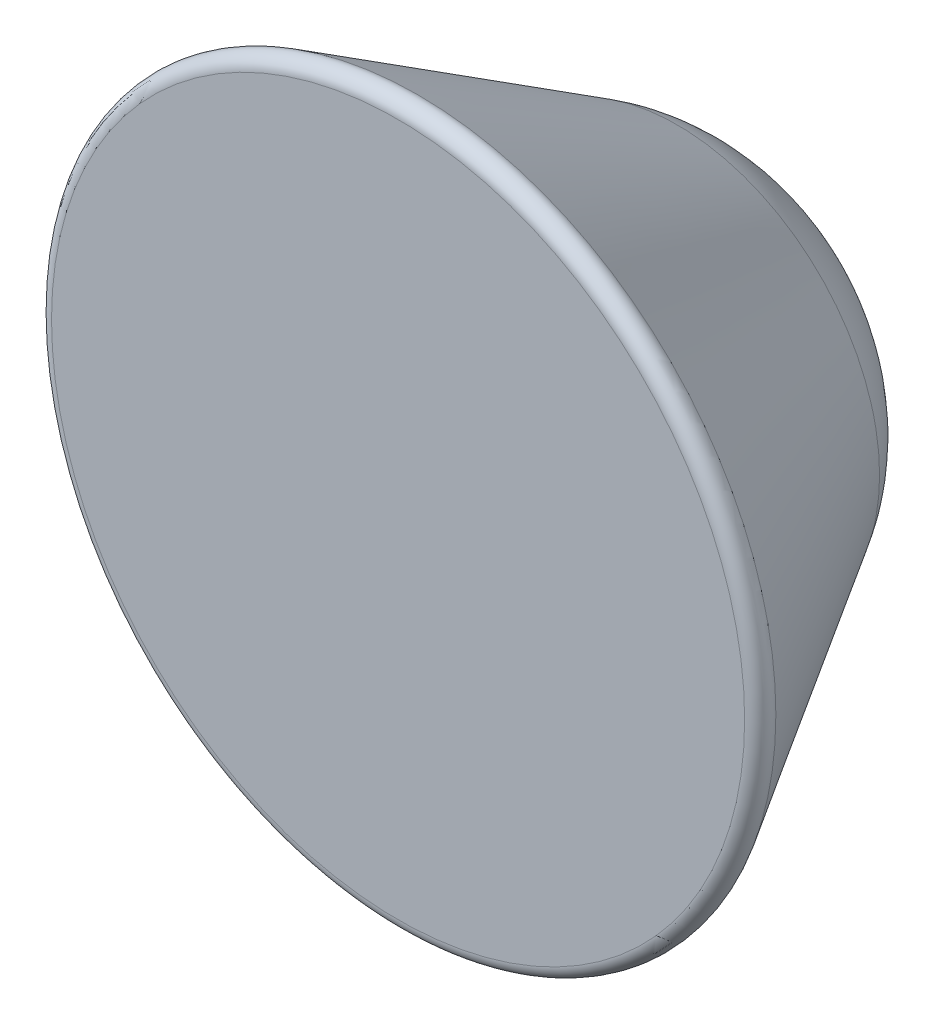
ISO-10303-21;
HEADER;
FILE_DESCRIPTION(('STEP AP214'),'2;1');
FILE_NAME('part.step','',(''),(''),'','','');
FILE_SCHEMA(('AUTOMOTIVE_DESIGN { 1 0 10303 214 1 1 1 1 }'));
ENDSEC;
DATA;
#1=APPLICATION_CONTEXT('core data for automotive mechanical design processes');
#2=APPLICATION_PROTOCOL_DEFINITION('international standard','automotive_design',2000,#1);
#3=PRODUCT_CONTEXT('',#1,'mechanical');
#4=PRODUCT('Part','Part','',(#3));
#5=PRODUCT_RELATED_PRODUCT_CATEGORY('part','',(#4));
#6=PRODUCT_DEFINITION_FORMATION('','',#4);
#7=PRODUCT_DEFINITION_CONTEXT('part definition',#1,'design');
#8=PRODUCT_DEFINITION('design','',#6,#7);
#9=PRODUCT_DEFINITION_SHAPE('','',#8);
#10=(LENGTH_UNIT() NAMED_UNIT(*) SI_UNIT(.MILLI.,.METRE.));
#11=(NAMED_UNIT(*) PLANE_ANGLE_UNIT() SI_UNIT($,.RADIAN.));
#12=(NAMED_UNIT(*) SI_UNIT($,.STERADIAN.) SOLID_ANGLE_UNIT());
#13=UNCERTAINTY_MEASURE_WITH_UNIT(LENGTH_MEASURE(1.E-05),#10,'distance_accuracy_value','');
#14=(GEOMETRIC_REPRESENTATION_CONTEXT(3) GLOBAL_UNCERTAINTY_ASSIGNED_CONTEXT((#13)) GLOBAL_UNIT_ASSIGNED_CONTEXT((#10,
#11,#12)) REPRESENTATION_CONTEXT('',''));
#15=CARTESIAN_POINT('',(0.,0.,0.));
#16=DIRECTION('',(0.,0.,1.));
#17=DIRECTION('',(1.,0.,0.));
#18=AXIS2_PLACEMENT_3D('',#15,#16,#17);
#19=CARTESIAN_POINT('',(-5.01428863092819,0.,-57.));
#20=CARTESIAN_POINT('',(-5.01428863092819,-5.01428863092819,-57.));
#21=CARTESIAN_POINT('',(0.,-5.01428863092819,-57.));
#22=CARTESIAN_POINT('',(5.01428863092819,-5.01428863092819,-57.));
#23=CARTESIAN_POINT('',(5.01428863092819,0.,-57.));
#24=CARTESIAN_POINT('',(5.01428863092819,5.01428863092819,-57.));
#25=CARTESIAN_POINT('',(0.,5.01428863092819,-57.));
#26=CARTESIAN_POINT('',(-5.01428863092819,5.01428863092819,-57.));
#27=CARTESIAN_POINT('',(-5.01428863092819,0.,-57.));
#28=CARTESIAN_POINT('',(-22.,0.,-57.0000000000001));
#29=CARTESIAN_POINT('',(-22.,-22.,-57.));
#30=CARTESIAN_POINT('',(0.,-22.,-57.0000000000001));
#31=CARTESIAN_POINT('',(22.,-22.,-57.));
#32=CARTESIAN_POINT('',(22.,0.,-57.0000000000001));
#33=CARTESIAN_POINT('',(22.,22.,-57.));
#34=CARTESIAN_POINT('',(0.,22.,-57.0000000000001));
#35=CARTESIAN_POINT('',(-22.,22.,-57.));
#36=CARTESIAN_POINT('',(-22.,0.,-57.0000000000001));
#37=CARTESIAN_POINT('',(-30.7390764023045,0.,-42.4348726628258));
#38=CARTESIAN_POINT('',(-30.7390764023045,-30.7390764023045,-42.4348726628258));
#39=CARTESIAN_POINT('',(0.,-30.7390764023045,-42.4348726628258));
#40=CARTESIAN_POINT('',(30.7390764023045,-30.7390764023045,-42.4348726628258));
#41=CARTESIAN_POINT('',(30.7390764023045,0.,-42.4348726628258));
#42=CARTESIAN_POINT('',(30.7390764023045,30.7390764023045,-42.4348726628258));
#43=CARTESIAN_POINT('',(0.,30.7390764023045,-42.4348726628258));
#44=CARTESIAN_POINT('',(-30.7390764023045,30.7390764023045,-42.4348726628258));
#45=CARTESIAN_POINT('',(-30.7390764023045,0.,-42.4348726628258));
#46=(BOUNDED_SURFACE() B_SPLINE_SURFACE(2,2,((#19,#20,#21,#22,#23,#24,#25,#26,#27),(#28,#29,#30,
#31,#32,#33,#34,#35,#36),(#37,#38,#39,#40,#41,#42,#43,#44,#45)),.UNSPECIFIED.,.F.,.T.,
.F.) B_SPLINE_SURFACE_WITH_KNOTS((3,3),(3,2,2,2,3),(-1.5707963267949,-0.540419500270584),
(-3.14159265358979,-1.5707963267949,0.,1.5707963267949,3.14159265358979),
.UNSPECIFIED.) GEOMETRIC_REPRESENTATION_ITEM() RATIONAL_B_SPLINE_SURFACE(((1.,0.707106781186548,
1.,0.707106781186548,1.,0.707106781186548,1.,0.707106781186548,1.),(0.870199906753478,
0.615324255053285,0.870199906753478,0.615324255053285,0.870199906753478,0.615324255053285,
0.870199906753478,0.615324255053285,0.870199906753478),(1.,0.707106781186548,1.,
0.707106781186548,1.,0.707106781186548,1.,0.707106781186548,1.))) REPRESENTATION_ITEM('') SURFACE());
#47=CARTESIAN_POINT('',(0.,0.,-42.4348726628258));
#48=DIRECTION('',(0.,0.,-1.));
#49=DIRECTION('',(-1.,0.,0.));
#50=AXIS2_PLACEMENT_3D('',#47,#48,#49);
#51=CIRCLE('',#50,30.7390764023045);
#52=CARTESIAN_POINT('',(-30.7390764023045,0.,-42.4348726628258));
#53=VERTEX_POINT('',#52);
#54=EDGE_CURVE('E71',#53,#53,#51,.T.);
#55=CARTESIAN_POINT('',(-5.01428863092819,0.,-27.));
#56=DIRECTION('',(0.,-1.,0.));
#57=DIRECTION('',(-1.,0.,0.));
#58=AXIS2_PLACEMENT_3D('',#55,#56,#57);
#59=CIRCLE('',#58,30.);
#60=CARTESIAN_POINT('',(-5.01428863092819,0.,-57.));
#61=VERTEX_POINT('',#60);
#62=EDGE_CURVE('E66',#53,#61,#59,.T.);
#63=CARTESIAN_POINT('',(0.,0.,-57.));
#64=DIRECTION('',(0.,0.,1.));
#65=DIRECTION('',(-1.,0.,0.));
#66=AXIS2_PLACEMENT_3D('',#63,#64,#65);
#67=CIRCLE('',#66,5.01428863092819);
#68=EDGE_CURVE('E62',#61,#61,#67,.T.);
#69=ORIENTED_EDGE('',*,*,#54,.T.);
#70=ORIENTED_EDGE('',*,*,#62,.T.);
#71=ORIENTED_EDGE('',*,*,#68,.T.);
#72=ORIENTED_EDGE('',*,*,#62,.F.);
#73=EDGE_LOOP('',(#69,#70,#71,#72));
#74=FACE_BOUND('',#73,.T.);
#75=ADVANCED_FACE('F38',(#74),#46,.F.);
#76=CARTESIAN_POINT('',(0.,0.,-57.));
#77=DIRECTION('',(0.,0.,1.));
#78=DIRECTION('',(1.,0.,0.));
#79=AXIS2_PLACEMENT_3D('',#76,#77,#78);
#80=PLANE('',#79);
#81=ORIENTED_EDGE('',*,*,#68,.F.);
#82=EDGE_LOOP('',(#81));
#83=FACE_BOUND('',#82,.T.);
#84=ADVANCED_FACE('F64',(#83),#80,.F.);
#85=CARTESIAN_POINT('',(0.,0.,0.));
#86=DIRECTION('',(0.,0.,1.));
#87=DIRECTION('',(1.,0.,0.));
#88=AXIS2_PLACEMENT_3D('',#85,#86,#87);
#89=CONICAL_SURFACE('',#88,56.2,0.540419500270585);
#90=DIRECTION('',(-0.514495755427527,0.,0.857492925712544));
#91=VECTOR('',#90,1.);
#92=CARTESIAN_POINT('',(-56.2,0.,0.));
#93=LINE('',#92,#91);
#94=CARTESIAN_POINT('',(-54.382605093487,0.,-3.02899151085505));
#95=VERTEX_POINT('',#94);
#96=EDGE_CURVE('E67',#53,#95,#93,.T.);
#97=ORIENTED_EDGE('',*,*,#96,.T.);
#98=CARTESIAN_POINT('',(0.,0.,-3.02899151085505));
#99=DIRECTION('',(0.,0.,1.));
#100=DIRECTION('',(1.,0.,0.));
#101=AXIS2_PLACEMENT_3D('',#98,#99,#100);
#102=CIRCLE('',#101,54.382605093487);
#103=EDGE_CURVE('E47',#95,#95,#102,.F.);
#104=ORIENTED_EDGE('',*,*,#103,.T.);
#105=ORIENTED_EDGE('',*,*,#96,.F.);
#106=ORIENTED_EDGE('',*,*,#54,.F.);
#107=EDGE_LOOP('',(#97,#104,#105,#106));
#108=FACE_BOUND('',#107,.T.);
#109=ADVANCED_FACE('F80',(#108),#89,.T.);
#110=CARTESIAN_POINT('',(0.,0.,0.));
#111=DIRECTION('',(0.,0.,-1.));
#112=DIRECTION('',(0.,-1.,0.));
#113=AXIS2_PLACEMENT_3D('',#110,#111,#112);
#114=PLANE('',#113);
#115=CARTESIAN_POINT('',(0.,0.,0.));
#116=DIRECTION('',(0.,0.,-1.));
#117=DIRECTION('',(-1.,0.,0.));
#118=AXIS2_PLACEMENT_3D('',#115,#116,#117);
#119=CIRCLE('',#118,52.6676192420619);
#120=CARTESIAN_POINT('',(-52.6676192420619,0.,0.));
#121=VERTEX_POINT('',#120);
#122=EDGE_CURVE('E11',#121,#121,#119,.F.);
#123=ORIENTED_EDGE('',*,*,#122,.T.);
#124=EDGE_LOOP('',(#123));
#125=FACE_BOUND('',#124,.T.);
#126=ADVANCED_FACE('F82',(#125),#114,.F.);
#127=CARTESIAN_POINT('',(0.,0.,-2.));
#128=DIRECTION('',(0.,0.,-1.));
#129=DIRECTION('',(-1.,0.,0.));
#130=AXIS2_PLACEMENT_3D('',#127,#128,#129);
#131=TOROIDAL_SURFACE('',#130,52.6676192420619,2.);
#132=CARTESIAN_POINT('',(-52.6676192420619,0.,-2.));
#133=DIRECTION('',(0.,-1.,0.));
#134=DIRECTION('',(1.,0.,0.));
#135=AXIS2_PLACEMENT_3D('',#132,#133,#134);
#136=CIRCLE('',#135,2.);
#137=EDGE_CURVE('E42',#121,#95,#136,.T.);
#138=ORIENTED_EDGE('',*,*,#137,.F.);
#139=ORIENTED_EDGE('',*,*,#122,.F.);
#140=ORIENTED_EDGE('',*,*,#137,.T.);
#141=ORIENTED_EDGE('',*,*,#103,.F.);
#142=EDGE_LOOP('',(#138,#139,#140,#141));
#143=FACE_BOUND('',#142,.T.);
#144=ADVANCED_FACE('F40',(#143),#131,.T.);
#145=CLOSED_SHELL('',(#75,#84,#109,#126,#144));
#146=MANIFOLD_SOLID_BREP('B2',#145);
#147=ADVANCED_BREP_SHAPE_REPRESENTATION('',(#18,#146),#14);
#148=SHAPE_DEFINITION_REPRESENTATION(#9,#147);
ENDSEC;
END-ISO-10303-21;
